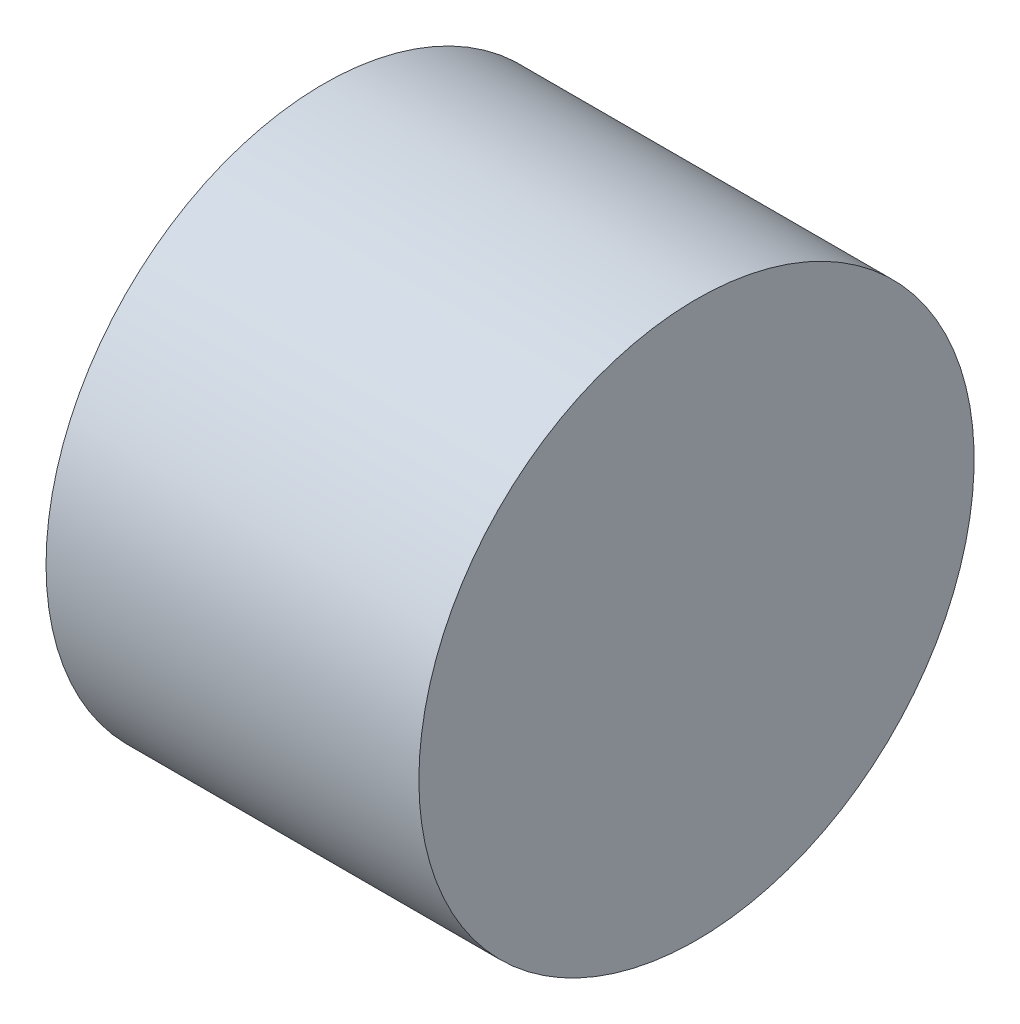
ISO-10303-21;
HEADER;
FILE_DESCRIPTION(('STEP AP214'),'2;1');
FILE_NAME('part.step','',(''),(''),'','','');
FILE_SCHEMA(('AUTOMOTIVE_DESIGN { 1 0 10303 214 1 1 1 1 }'));
ENDSEC;
DATA;
#1=APPLICATION_CONTEXT('core data for automotive mechanical design processes');
#2=APPLICATION_PROTOCOL_DEFINITION('international standard','automotive_design',2000,#1);
#3=PRODUCT_CONTEXT('',#1,'mechanical');
#4=PRODUCT('Part','Part','',(#3));
#5=PRODUCT_RELATED_PRODUCT_CATEGORY('part','',(#4));
#6=PRODUCT_DEFINITION_FORMATION('','',#4);
#7=PRODUCT_DEFINITION_CONTEXT('part definition',#1,'design');
#8=PRODUCT_DEFINITION('design','',#6,#7);
#9=PRODUCT_DEFINITION_SHAPE('','',#8);
#10=(LENGTH_UNIT() NAMED_UNIT(*) SI_UNIT(.MILLI.,.METRE.));
#11=(NAMED_UNIT(*) PLANE_ANGLE_UNIT() SI_UNIT($,.RADIAN.));
#12=(NAMED_UNIT(*) SI_UNIT($,.STERADIAN.) SOLID_ANGLE_UNIT());
#13=UNCERTAINTY_MEASURE_WITH_UNIT(LENGTH_MEASURE(1.E-05),#10,'distance_accuracy_value','');
#14=(GEOMETRIC_REPRESENTATION_CONTEXT(3) GLOBAL_UNCERTAINTY_ASSIGNED_CONTEXT((#13)) GLOBAL_UNIT_ASSIGNED_CONTEXT((#10,
#11,#12)) REPRESENTATION_CONTEXT('',''));
#15=CARTESIAN_POINT('',(0.,0.,0.));
#16=DIRECTION('',(0.,0.,1.));
#17=DIRECTION('',(1.,0.,0.));
#18=AXIS2_PLACEMENT_3D('',#15,#16,#17);
#19=CARTESIAN_POINT('',(17.5,0.,0.));
#20=DIRECTION('',(-1.,0.,0.));
#21=DIRECTION('',(0.,0.,1.));
#22=AXIS2_PLACEMENT_3D('',#19,#20,#21);
#23=PLANE('',#22);
#24=CARTESIAN_POINT('',(17.5,0.,0.));
#25=DIRECTION('',(-1.,0.,0.));
#26=DIRECTION('',(0.,0.,1.));
#27=AXIS2_PLACEMENT_3D('',#24,#25,#26);
#28=CIRCLE('',#27,17.5);
#29=CARTESIAN_POINT('',(17.5,0.,17.5));
#30=VERTEX_POINT('',#29);
#31=EDGE_CURVE('E10',#30,#30,#28,.T.);
#32=ORIENTED_EDGE('',*,*,#31,.F.);
#33=EDGE_LOOP('',(#32));
#34=FACE_BOUND('',#33,.T.);
#35=ADVANCED_FACE('F41',(#34),#23,.F.);
#36=CARTESIAN_POINT('',(-27.6477644712238,0.,0.));
#37=DIRECTION('',(-1.,0.,0.));
#38=DIRECTION('',(0.,0.,1.));
#39=AXIS2_PLACEMENT_3D('',#36,#37,#38);
#40=CYLINDRICAL_SURFACE('',#39,17.5);
#41=CARTESIAN_POINT('',(-6.,0.,0.));
#42=DIRECTION('',(-1.,0.,0.));
#43=DIRECTION('',(0.,0.,1.));
#44=AXIS2_PLACEMENT_3D('',#41,#42,#43);
#45=CIRCLE('',#44,17.5);
#46=CARTESIAN_POINT('',(-6.,0.,17.5));
#47=VERTEX_POINT('',#46);
#48=EDGE_CURVE('E48',#47,#47,#45,.T.);
#49=ORIENTED_EDGE('',*,*,#48,.F.);
#50=EDGE_LOOP('',(#49));
#51=FACE_BOUND('',#50,.T.);
#52=ORIENTED_EDGE('',*,*,#31,.T.);
#53=EDGE_LOOP('',(#52));
#54=FACE_BOUND('',#53,.T.);
#55=ADVANCED_FACE('F65',(#51,#54),#40,.T.);
#56=CARTESIAN_POINT('',(-6.,0.,-17.5));
#57=DIRECTION('',(1.,0.,0.));
#58=DIRECTION('',(0.,0.,-1.));
#59=AXIS2_PLACEMENT_3D('',#56,#57,#58);
#60=PLANE('',#59);
#61=CARTESIAN_POINT('',(-5.99999999999999,0.,0.));
#62=DIRECTION('',(-1.,0.,0.));
#63=DIRECTION('',(0.,0.,1.));
#64=AXIS2_PLACEMENT_3D('',#61,#62,#63);
#65=CIRCLE('',#64,10.3923048454133);
#66=CARTESIAN_POINT('',(-5.99999999999999,0.,10.3923048454133));
#67=VERTEX_POINT('',#66);
#68=EDGE_CURVE('E54',#67,#67,#65,.T.);
#69=ORIENTED_EDGE('',*,*,#68,.F.);
#70=EDGE_LOOP('',(#69));
#71=FACE_BOUND('',#70,.T.);
#72=ORIENTED_EDGE('',*,*,#48,.T.);
#73=EDGE_LOOP('',(#72));
#74=FACE_BOUND('',#73,.T.);
#75=ADVANCED_FACE('F63',(#71,#74),#60,.F.);
#76=CARTESIAN_POINT('',(0.,0.,0.));
#77=DIRECTION('',(-1.,0.,0.));
#78=DIRECTION('',(0.,0.,-1.));
#79=AXIS2_PLACEMENT_3D('',#76,#77,#78);
#80=SPHERICAL_SURFACE('',#79,12.);
#81=ORIENTED_EDGE('',*,*,#68,.T.);
#82=EDGE_LOOP('',(#81));
#83=FACE_BOUND('',#82,.T.);
#84=ADVANCED_FACE('F61',(#83),#80,.F.);
#85=CLOSED_SHELL('',(#35,#55,#75,#84));
#86=MANIFOLD_SOLID_BREP('B2',#85);
#87=ADVANCED_BREP_SHAPE_REPRESENTATION('',(#18,#86),#14);
#88=SHAPE_DEFINITION_REPRESENTATION(#9,#87);
ENDSEC;
END-ISO-10303-21;
